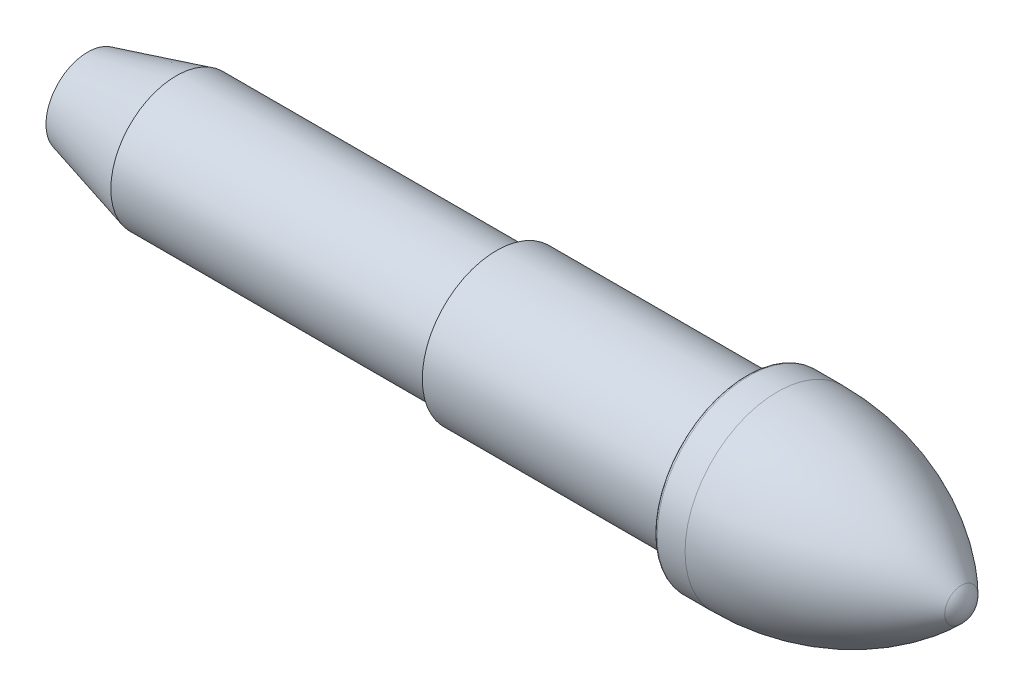
ISO-10303-21;
HEADER;
FILE_DESCRIPTION(('STEP AP214'),'2;1');
FILE_NAME('part.step','',(''),(''),'','','');
FILE_SCHEMA(('AUTOMOTIVE_DESIGN { 1 0 10303 214 1 1 1 1 }'));
ENDSEC;
DATA;
#1=APPLICATION_CONTEXT('core data for automotive mechanical design processes');
#2=APPLICATION_PROTOCOL_DEFINITION('international standard','automotive_design',2000,#1);
#3=PRODUCT_CONTEXT('',#1,'mechanical');
#4=PRODUCT('Part','Part','',(#3));
#5=PRODUCT_RELATED_PRODUCT_CATEGORY('part','',(#4));
#6=PRODUCT_DEFINITION_FORMATION('','',#4);
#7=PRODUCT_DEFINITION_CONTEXT('part definition',#1,'design');
#8=PRODUCT_DEFINITION('design','',#6,#7);
#9=PRODUCT_DEFINITION_SHAPE('','',#8);
#10=(LENGTH_UNIT() NAMED_UNIT(*) SI_UNIT(.MILLI.,.METRE.));
#11=(NAMED_UNIT(*) PLANE_ANGLE_UNIT() SI_UNIT($,.RADIAN.));
#12=(NAMED_UNIT(*) SI_UNIT($,.STERADIAN.) SOLID_ANGLE_UNIT());
#13=UNCERTAINTY_MEASURE_WITH_UNIT(LENGTH_MEASURE(1.E-05),#10,'distance_accuracy_value','');
#14=(GEOMETRIC_REPRESENTATION_CONTEXT(3) GLOBAL_UNCERTAINTY_ASSIGNED_CONTEXT((#13)) GLOBAL_UNIT_ASSIGNED_CONTEXT((#10,
#11,#12)) REPRESENTATION_CONTEXT('',''));
#15=CARTESIAN_POINT('',(0.,0.,0.));
#16=DIRECTION('',(0.,0.,1.));
#17=DIRECTION('',(1.,0.,0.));
#18=AXIS2_PLACEMENT_3D('',#15,#16,#17);
#19=CARTESIAN_POINT('',(0.,0.,0.));
#20=DIRECTION('',(-1.,0.,0.));
#21=DIRECTION('',(0.,0.,1.));
#22=AXIS2_PLACEMENT_3D('',#19,#20,#21);
#23=PLANE('',#22);
#24=CARTESIAN_POINT('',(0.,0.,0.));
#25=DIRECTION('',(-1.,0.,0.));
#26=DIRECTION('',(0.,0.,1.));
#27=AXIS2_PLACEMENT_3D('',#24,#25,#26);
#28=CIRCLE('',#27,1.335);
#29=CARTESIAN_POINT('',(0.,0.,1.335));
#30=VERTEX_POINT('',#29);
#31=EDGE_CURVE('E43',#30,#30,#28,.T.);
#32=ORIENTED_EDGE('',*,*,#31,.T.);
#33=EDGE_LOOP('',(#32));
#34=FACE_BOUND('',#33,.T.);
#35=ADVANCED_FACE('F32',(#34),#23,.T.);
#36=CARTESIAN_POINT('',(0.,0.,0.));
#37=DIRECTION('',(1.,0.,0.));
#38=DIRECTION('',(0.,0.,-1.));
#39=AXIS2_PLACEMENT_3D('',#36,#37,#38);
#40=CONICAL_SURFACE('',#39,1.335,0.26179938779915);
#41=CARTESIAN_POINT('',(2.83635861375234,0.,0.));
#42=DIRECTION('',(-1.,0.,0.));
#43=DIRECTION('',(0.,0.,1.));
#44=AXIS2_PLACEMENT_3D('',#41,#42,#43);
#45=CIRCLE('',#44,2.095);
#46=CARTESIAN_POINT('',(2.83635861375234,0.,2.095));
#47=VERTEX_POINT('',#46);
#48=EDGE_CURVE('E47',#47,#47,#45,.T.);
#49=ORIENTED_EDGE('',*,*,#48,.T.);
#50=EDGE_LOOP('',(#49));
#51=FACE_BOUND('',#50,.T.);
#52=ORIENTED_EDGE('',*,*,#31,.F.);
#53=EDGE_LOOP('',(#52));
#54=FACE_BOUND('',#53,.T.);
#55=ADVANCED_FACE('F82',(#51,#54),#40,.T.);
#56=CARTESIAN_POINT('',(0.,0.,0.));
#57=DIRECTION('',(-1.,0.,0.));
#58=DIRECTION('',(0.,0.,1.));
#59=AXIS2_PLACEMENT_3D('',#56,#57,#58);
#60=CYLINDRICAL_SURFACE('',#59,2.095);
#61=CARTESIAN_POINT('',(13.09,0.,0.));
#62=DIRECTION('',(-1.,0.,0.));
#63=DIRECTION('',(0.,0.,1.));
#64=AXIS2_PLACEMENT_3D('',#61,#62,#63);
#65=CIRCLE('',#64,2.095);
#66=CARTESIAN_POINT('',(13.09,0.,2.095));
#67=VERTEX_POINT('',#66);
#68=EDGE_CURVE('E52',#67,#67,#65,.T.);
#69=ORIENTED_EDGE('',*,*,#68,.T.);
#70=EDGE_LOOP('',(#69));
#71=FACE_BOUND('',#70,.T.);
#72=ORIENTED_EDGE('',*,*,#48,.F.);
#73=EDGE_LOOP('',(#72));
#74=FACE_BOUND('',#73,.T.);
#75=ADVANCED_FACE('F87',(#71,#74),#60,.T.);
#76=CARTESIAN_POINT('',(13.09,2.095,0.));
#77=DIRECTION('',(-1.,0.,0.));
#78=DIRECTION('',(0.,0.,1.));
#79=AXIS2_PLACEMENT_3D('',#76,#77,#78);
#80=PLANE('',#79);
#81=CARTESIAN_POINT('',(13.09,0.,0.));
#82=DIRECTION('',(-1.,0.,0.));
#83=DIRECTION('',(0.,0.,1.));
#84=AXIS2_PLACEMENT_3D('',#81,#82,#83);
#85=CIRCLE('',#84,2.375);
#86=CARTESIAN_POINT('',(13.09,0.,2.375));
#87=VERTEX_POINT('',#86);
#88=EDGE_CURVE('E55',#87,#87,#85,.T.);
#89=ORIENTED_EDGE('',*,*,#88,.T.);
#90=EDGE_LOOP('',(#89));
#91=FACE_BOUND('',#90,.T.);
#92=ORIENTED_EDGE('',*,*,#68,.F.);
#93=EDGE_LOOP('',(#92));
#94=FACE_BOUND('',#93,.T.);
#95=ADVANCED_FACE('F93',(#91,#94),#80,.T.);
#96=CARTESIAN_POINT('',(0.,0.,0.));
#97=DIRECTION('',(-1.,0.,0.));
#98=DIRECTION('',(0.,0.,1.));
#99=AXIS2_PLACEMENT_3D('',#96,#97,#98);
#100=CYLINDRICAL_SURFACE('',#99,2.375);
#101=CARTESIAN_POINT('',(21.09,0.,0.));
#102=DIRECTION('',(-1.,0.,0.));
#103=DIRECTION('',(0.,0.,1.));
#104=AXIS2_PLACEMENT_3D('',#101,#102,#103);
#105=CIRCLE('',#104,2.375);
#106=CARTESIAN_POINT('',(21.09,0.,2.375));
#107=VERTEX_POINT('',#106);
#108=EDGE_CURVE('E58',#107,#107,#105,.T.);
#109=ORIENTED_EDGE('',*,*,#108,.T.);
#110=EDGE_LOOP('',(#109));
#111=FACE_BOUND('',#110,.T.);
#112=ORIENTED_EDGE('',*,*,#88,.F.);
#113=EDGE_LOOP('',(#112));
#114=FACE_BOUND('',#113,.T.);
#115=ADVANCED_FACE('F97',(#111,#114),#100,.T.);
#116=CARTESIAN_POINT('',(21.09,2.375,0.));
#117=DIRECTION('',(-1.,0.,0.));
#118=DIRECTION('',(0.,0.,1.));
#119=AXIS2_PLACEMENT_3D('',#116,#117,#118);
#120=PLANE('',#119);
#121=CARTESIAN_POINT('',(21.09,0.,0.));
#122=DIRECTION('',(-1.,0.,0.));
#123=DIRECTION('',(0.,0.,1.));
#124=AXIS2_PLACEMENT_3D('',#121,#122,#123);
#125=CIRCLE('',#124,2.855);
#126=CARTESIAN_POINT('',(21.09,0.,2.855));
#127=VERTEX_POINT('',#126);
#128=EDGE_CURVE('E39',#127,#127,#125,.T.);
#129=ORIENTED_EDGE('',*,*,#128,.T.);
#130=EDGE_LOOP('',(#129));
#131=FACE_BOUND('',#130,.T.);
#132=ORIENTED_EDGE('',*,*,#108,.F.);
#133=EDGE_LOOP('',(#132));
#134=FACE_BOUND('',#133,.T.);
#135=ADVANCED_FACE('F101',(#131,#134),#120,.T.);
#136=CARTESIAN_POINT('',(0.,0.,0.));
#137=DIRECTION('',(-1.,0.,0.));
#138=DIRECTION('',(0.,0.,1.));
#139=AXIS2_PLACEMENT_3D('',#136,#137,#138);
#140=CYLINDRICAL_SURFACE('',#139,2.955);
#141=CARTESIAN_POINT('',(21.19,0.,0.));
#142=DIRECTION('',(-1.,0.,0.));
#143=DIRECTION('',(0.,0.,1.));
#144=AXIS2_PLACEMENT_3D('',#141,#142,#143);
#145=CIRCLE('',#144,2.955);
#146=CARTESIAN_POINT('',(21.19,0.,2.955));
#147=VERTEX_POINT('',#146);
#148=EDGE_CURVE('E10',#147,#147,#145,.F.);
#149=ORIENTED_EDGE('',*,*,#148,.T.);
#150=EDGE_LOOP('',(#149));
#151=FACE_BOUND('',#150,.T.);
#152=CARTESIAN_POINT('',(22.0847157577627,0.,0.));
#153=DIRECTION('',(-1.,0.,0.));
#154=DIRECTION('',(0.,0.,1.));
#155=AXIS2_PLACEMENT_3D('',#152,#153,#154);
#156=CIRCLE('',#155,2.955);
#157=CARTESIAN_POINT('',(22.0847157577627,0.,2.955));
#158=VERTEX_POINT('',#157);
#159=EDGE_CURVE('E61',#158,#158,#156,.T.);
#160=ORIENTED_EDGE('',*,*,#159,.T.);
#161=EDGE_LOOP('',(#160));
#162=FACE_BOUND('',#161,.T.);
#163=ADVANCED_FACE('F79',(#151,#162),#140,.T.);
#164=CARTESIAN_POINT('',(22.0847157577627,0.,0.));
#165=DIRECTION('',(-1.,0.,0.));
#166=DIRECTION('',(0.,0.,1.));
#167=AXIS2_PLACEMENT_3D('',#164,#165,#166);
#168=DEGENERATE_TOROIDAL_SURFACE('',#167,5.425,8.38,.F.);
#169=CARTESIAN_POINT('',(27.9773870487127,0.,0.));
#170=DIRECTION('',(-1.,0.,0.));
#171=DIRECTION('',(0.,0.,1.));
#172=AXIS2_PLACEMENT_3D('',#169,#170,#171);
#173=CIRCLE('',#172,0.533256880733945);
#174=CARTESIAN_POINT('',(27.9773870487127,0.,0.533256880733945));
#175=VERTEX_POINT('',#174);
#176=EDGE_CURVE('E64',#175,#175,#173,.T.);
#177=ORIENTED_EDGE('',*,*,#176,.T.);
#178=EDGE_LOOP('',(#177));
#179=FACE_BOUND('',#178,.T.);
#180=ORIENTED_EDGE('',*,*,#159,.F.);
#181=EDGE_LOOP('',(#180));
#182=FACE_BOUND('',#181,.T.);
#183=ADVANCED_FACE('F68',(#179,#182),#168,.F.);
#184=CARTESIAN_POINT('',(27.45,0.,0.));
#185=DIRECTION('',(-1.,0.,0.));
#186=DIRECTION('',(0.,1.,0.));
#187=AXIS2_PLACEMENT_3D('',#184,#185,#186);
#188=SPHERICAL_SURFACE('',#187,0.75);
#189=ORIENTED_EDGE('',*,*,#176,.F.);
#190=EDGE_LOOP('',(#189));
#191=FACE_BOUND('',#190,.T.);
#192=ADVANCED_FACE('F71',(#191),#188,.T.);
#193=CARTESIAN_POINT('',(21.19,0.,0.));
#194=DIRECTION('',(-1.,0.,0.));
#195=DIRECTION('',(0.,0.,1.));
#196=AXIS2_PLACEMENT_3D('',#193,#194,#195);
#197=TOROIDAL_SURFACE('',#196,2.855,0.1);
#198=ORIENTED_EDGE('',*,*,#148,.F.);
#199=EDGE_LOOP('',(#198));
#200=FACE_BOUND('',#199,.T.);
#201=ORIENTED_EDGE('',*,*,#128,.F.);
#202=EDGE_LOOP('',(#201));
#203=FACE_BOUND('',#202,.T.);
#204=ADVANCED_FACE('F34',(#200,#203),#197,.T.);
#205=CLOSED_SHELL('',(#35,#55,#75,#95,#115,#135,#163,#183,#192,#204));
#206=MANIFOLD_SOLID_BREP('B2',#205);
#207=ADVANCED_BREP_SHAPE_REPRESENTATION('',(#18,#206),#14);
#208=SHAPE_DEFINITION_REPRESENTATION(#9,#207);
ENDSEC;
END-ISO-10303-21;
